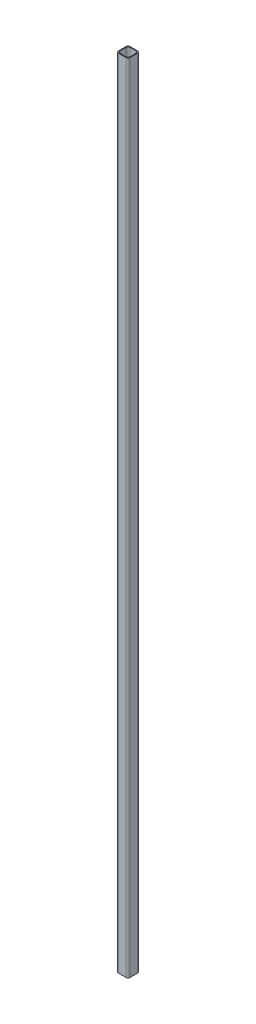
ISO-10303-21;
HEADER;
FILE_DESCRIPTION(('STEP AP214'),'2;1');
FILE_NAME('part.step','',(''),(''),'','','');
FILE_SCHEMA(('AUTOMOTIVE_DESIGN { 1 0 10303 214 1 1 1 1 }'));
ENDSEC;
DATA;
#1=APPLICATION_CONTEXT('core data for automotive mechanical design processes');
#2=APPLICATION_PROTOCOL_DEFINITION('international standard','automotive_design',2000,#1);
#3=PRODUCT_CONTEXT('',#1,'mechanical');
#4=PRODUCT('Part','Part','',(#3));
#5=PRODUCT_RELATED_PRODUCT_CATEGORY('part','',(#4));
#6=PRODUCT_DEFINITION_FORMATION('','',#4);
#7=PRODUCT_DEFINITION_CONTEXT('part definition',#1,'design');
#8=PRODUCT_DEFINITION('design','',#6,#7);
#9=PRODUCT_DEFINITION_SHAPE('','',#8);
#10=(LENGTH_UNIT() NAMED_UNIT(*) SI_UNIT(.MILLI.,.METRE.));
#11=(NAMED_UNIT(*) PLANE_ANGLE_UNIT() SI_UNIT($,.RADIAN.));
#12=(NAMED_UNIT(*) SI_UNIT($,.STERADIAN.) SOLID_ANGLE_UNIT());
#13=UNCERTAINTY_MEASURE_WITH_UNIT(LENGTH_MEASURE(1.E-05),#10,'distance_accuracy_value','');
#14=(GEOMETRIC_REPRESENTATION_CONTEXT(3) GLOBAL_UNCERTAINTY_ASSIGNED_CONTEXT((#13)) GLOBAL_UNIT_ASSIGNED_CONTEXT((#10,
#11,#12)) REPRESENTATION_CONTEXT('',''));
#15=CARTESIAN_POINT('',(0.,0.,0.));
#16=DIRECTION('',(0.,0.,1.));
#17=DIRECTION('',(1.,0.,0.));
#18=AXIS2_PLACEMENT_3D('',#15,#16,#17);
#19=CARTESIAN_POINT('',(20.,4120.,-20.));
#20=DIRECTION('',(0.,-1.,0.));
#21=DIRECTION('',(0.,0.,-1.));
#22=AXIS2_PLACEMENT_3D('',#19,#20,#21);
#23=PLANE('',#22);
#24=CARTESIAN_POINT('',(20.,4120.,-20.));
#25=DIRECTION('',(0.,1.,0.));
#26=DIRECTION('',(0.,0.,-1.));
#27=AXIS2_PLACEMENT_3D('',#24,#25,#26);
#28=CIRCLE('',#27,10.);
#29=CARTESIAN_POINT('',(30.,4120.,-19.9999999999999));
#30=VERTEX_POINT('',#29);
#31=CARTESIAN_POINT('',(19.9999999999999,4120.,-30.));
#32=VERTEX_POINT('',#31);
#33=EDGE_CURVE('E212',#30,#32,#28,.T.);
#34=ORIENTED_EDGE('',*,*,#33,.T.);
#35=DIRECTION('',(-1.,0.,0.));
#36=VECTOR('',#35,1.);
#37=CARTESIAN_POINT('',(-19.9999999999999,4120.,-30.));
#38=LINE('',#37,#36);
#39=CARTESIAN_POINT('',(-19.9999999999999,4120.,-30.));
#40=VERTEX_POINT('',#39);
#41=EDGE_CURVE('E215',#32,#40,#38,.T.);
#42=ORIENTED_EDGE('',*,*,#41,.T.);
#43=CARTESIAN_POINT('',(-20.,4120.,-20.));
#44=DIRECTION('',(0.,1.,0.));
#45=DIRECTION('',(0.,0.,1.));
#46=AXIS2_PLACEMENT_3D('',#43,#44,#45);
#47=CIRCLE('',#46,10.);
#48=CARTESIAN_POINT('',(-30.,4120.,-19.9999999999999));
#49=VERTEX_POINT('',#48);
#50=EDGE_CURVE('E218',#40,#49,#47,.T.);
#51=ORIENTED_EDGE('',*,*,#50,.T.);
#52=DIRECTION('',(0.,0.,1.));
#53=VECTOR('',#52,1.);
#54=CARTESIAN_POINT('',(-30.,4120.,-19.9999999999999));
#55=LINE('',#54,#53);
#56=CARTESIAN_POINT('',(-30.,4120.,19.9999999999999));
#57=VERTEX_POINT('',#56);
#58=EDGE_CURVE('E220',#49,#57,#55,.T.);
#59=ORIENTED_EDGE('',*,*,#58,.T.);
#60=CARTESIAN_POINT('',(-20.,4120.,20.));
#61=DIRECTION('',(0.,1.,0.));
#62=DIRECTION('',(0.,0.,1.));
#63=AXIS2_PLACEMENT_3D('',#60,#61,#62);
#64=CIRCLE('',#63,10.);
#65=CARTESIAN_POINT('',(-20.,4120.,30.));
#66=VERTEX_POINT('',#65);
#67=EDGE_CURVE('E222',#57,#66,#64,.T.);
#68=ORIENTED_EDGE('',*,*,#67,.T.);
#69=DIRECTION('',(1.,0.,0.));
#70=VECTOR('',#69,1.);
#71=CARTESIAN_POINT('',(-19.9999999999999,4120.,30.));
#72=LINE('',#71,#70);
#73=CARTESIAN_POINT('',(19.9999999999999,4120.,30.));
#74=VERTEX_POINT('',#73);
#75=EDGE_CURVE('E224',#66,#74,#72,.T.);
#76=ORIENTED_EDGE('',*,*,#75,.T.);
#77=CARTESIAN_POINT('',(20.,4120.,20.));
#78=DIRECTION('',(0.,1.,0.));
#79=DIRECTION('',(0.,0.,1.));
#80=AXIS2_PLACEMENT_3D('',#77,#78,#79);
#81=CIRCLE('',#80,10.);
#82=CARTESIAN_POINT('',(30.,4120.,19.9999999999999));
#83=VERTEX_POINT('',#82);
#84=EDGE_CURVE('E226',#74,#83,#81,.T.);
#85=ORIENTED_EDGE('',*,*,#84,.T.);
#86=DIRECTION('',(0.,0.,-1.));
#87=VECTOR('',#86,1.);
#88=CARTESIAN_POINT('',(30.,4120.,-19.9999999999999));
#89=LINE('',#88,#87);
#90=EDGE_CURVE('E228',#83,#30,#89,.T.);
#91=ORIENTED_EDGE('',*,*,#90,.T.);
#92=EDGE_LOOP('',(#34,#42,#51,#59,#68,#76,#85,#91));
#93=FACE_BOUND('',#92,.T.);
#94=CARTESIAN_POINT('',(16.,4120.,16.));
#95=DIRECTION('',(0.,1.,0.));
#96=DIRECTION('',(0.,0.,1.));
#97=AXIS2_PLACEMENT_3D('',#94,#95,#96);
#98=CIRCLE('',#97,10.);
#99=CARTESIAN_POINT('',(15.9999999999999,4120.,26.));
#100=VERTEX_POINT('',#99);
#101=CARTESIAN_POINT('',(26.,4120.,15.9999999999999));
#102=VERTEX_POINT('',#101);
#103=EDGE_CURVE('E147',#100,#102,#98,.T.);
#104=ORIENTED_EDGE('',*,*,#103,.F.);
#105=DIRECTION('',(1.,0.,0.));
#106=VECTOR('',#105,1.);
#107=CARTESIAN_POINT('',(-15.9999999999999,4120.,26.));
#108=LINE('',#107,#106);
#109=CARTESIAN_POINT('',(-15.9999999999999,4120.,26.));
#110=VERTEX_POINT('',#109);
#111=EDGE_CURVE('E180',#110,#100,#108,.T.);
#112=ORIENTED_EDGE('',*,*,#111,.F.);
#113=CARTESIAN_POINT('',(-16.,4120.,16.));
#114=DIRECTION('',(0.,1.,0.));
#115=DIRECTION('',(0.,0.,1.));
#116=AXIS2_PLACEMENT_3D('',#113,#114,#115);
#117=CIRCLE('',#116,10.);
#118=CARTESIAN_POINT('',(-26.,4120.,15.9999999999999));
#119=VERTEX_POINT('',#118);
#120=EDGE_CURVE('E178',#119,#110,#117,.T.);
#121=ORIENTED_EDGE('',*,*,#120,.F.);
#122=DIRECTION('',(0.,0.,1.));
#123=VECTOR('',#122,1.);
#124=CARTESIAN_POINT('',(-26.,4120.,-15.9999999999999));
#125=LINE('',#124,#123);
#126=CARTESIAN_POINT('',(-26.,4120.,-15.9999999999999));
#127=VERTEX_POINT('',#126);
#128=EDGE_CURVE('E176',#127,#119,#125,.T.);
#129=ORIENTED_EDGE('',*,*,#128,.F.);
#130=CARTESIAN_POINT('',(-16.,4120.,-16.));
#131=DIRECTION('',(0.,1.,0.));
#132=DIRECTION('',(0.,0.,1.));
#133=AXIS2_PLACEMENT_3D('',#130,#131,#132);
#134=CIRCLE('',#133,10.);
#135=CARTESIAN_POINT('',(-15.9999999999999,4120.,-26.));
#136=VERTEX_POINT('',#135);
#137=EDGE_CURVE('E174',#136,#127,#134,.T.);
#138=ORIENTED_EDGE('',*,*,#137,.F.);
#139=DIRECTION('',(-1.,0.,0.));
#140=VECTOR('',#139,1.);
#141=CARTESIAN_POINT('',(-15.9999999999999,4120.,-26.));
#142=LINE('',#141,#140);
#143=CARTESIAN_POINT('',(15.9999999999999,4120.,-26.));
#144=VERTEX_POINT('',#143);
#145=EDGE_CURVE('E170',#144,#136,#142,.T.);
#146=ORIENTED_EDGE('',*,*,#145,.F.);
#147=CARTESIAN_POINT('',(16.,4120.,-16.));
#148=DIRECTION('',(0.,1.,0.));
#149=DIRECTION('',(0.,0.,-1.));
#150=AXIS2_PLACEMENT_3D('',#147,#148,#149);
#151=CIRCLE('',#150,10.);
#152=CARTESIAN_POINT('',(26.,4120.,-15.9999999999999));
#153=VERTEX_POINT('',#152);
#154=EDGE_CURVE('E168',#153,#144,#151,.T.);
#155=ORIENTED_EDGE('',*,*,#154,.F.);
#156=DIRECTION('',(0.,0.,-1.));
#157=VECTOR('',#156,1.);
#158=CARTESIAN_POINT('',(26.,4120.,-15.9999999999999));
#159=LINE('',#158,#157);
#160=EDGE_CURVE('E155',#102,#153,#159,.T.);
#161=ORIENTED_EDGE('',*,*,#160,.F.);
#162=EDGE_LOOP('',(#104,#112,#121,#129,#138,#146,#155,#161));
#163=FACE_BOUND('',#162,.T.);
#164=ADVANCED_FACE('F34',(#93,#163),#23,.F.);
#165=CARTESIAN_POINT('',(20.,0.,-20.));
#166=DIRECTION('',(0.,-1.,0.));
#167=DIRECTION('',(0.,0.,-1.));
#168=AXIS2_PLACEMENT_3D('',#165,#166,#167);
#169=PLANE('',#168);
#170=CARTESIAN_POINT('',(20.,0.,-20.));
#171=DIRECTION('',(0.,1.,0.));
#172=DIRECTION('',(0.,0.,-1.));
#173=AXIS2_PLACEMENT_3D('',#170,#171,#172);
#174=CIRCLE('',#173,10.);
#175=CARTESIAN_POINT('',(30.,0.,-19.9999999999999));
#176=VERTEX_POINT('',#175);
#177=CARTESIAN_POINT('',(19.9999999999999,0.,-30.));
#178=VERTEX_POINT('',#177);
#179=EDGE_CURVE('E163',#176,#178,#174,.T.);
#180=ORIENTED_EDGE('',*,*,#179,.F.);
#181=DIRECTION('',(0.,0.,-1.));
#182=VECTOR('',#181,1.);
#183=CARTESIAN_POINT('',(30.,0.,-19.9999999999999));
#184=LINE('',#183,#182);
#185=CARTESIAN_POINT('',(30.,0.,19.9999999999999));
#186=VERTEX_POINT('',#185);
#187=EDGE_CURVE('E216',#186,#176,#184,.T.);
#188=ORIENTED_EDGE('',*,*,#187,.F.);
#189=CARTESIAN_POINT('',(20.,0.,20.));
#190=DIRECTION('',(0.,1.,0.));
#191=DIRECTION('',(0.,0.,1.));
#192=AXIS2_PLACEMENT_3D('',#189,#190,#191);
#193=CIRCLE('',#192,10.);
#194=CARTESIAN_POINT('',(19.9999999999999,0.,30.));
#195=VERTEX_POINT('',#194);
#196=EDGE_CURVE('E243',#195,#186,#193,.T.);
#197=ORIENTED_EDGE('',*,*,#196,.F.);
#198=DIRECTION('',(1.,0.,0.));
#199=VECTOR('',#198,1.);
#200=CARTESIAN_POINT('',(-19.9999999999999,0.,30.));
#201=LINE('',#200,#199);
#202=CARTESIAN_POINT('',(-20.,0.,30.));
#203=VERTEX_POINT('',#202);
#204=EDGE_CURVE('E241',#203,#195,#201,.T.);
#205=ORIENTED_EDGE('',*,*,#204,.F.);
#206=CARTESIAN_POINT('',(-20.,0.,20.));
#207=DIRECTION('',(0.,1.,0.));
#208=DIRECTION('',(0.,0.,1.));
#209=AXIS2_PLACEMENT_3D('',#206,#207,#208);
#210=CIRCLE('',#209,10.);
#211=CARTESIAN_POINT('',(-30.,0.,19.9999999999999));
#212=VERTEX_POINT('',#211);
#213=EDGE_CURVE('E239',#212,#203,#210,.T.);
#214=ORIENTED_EDGE('',*,*,#213,.F.);
#215=DIRECTION('',(0.,0.,1.));
#216=VECTOR('',#215,1.);
#217=CARTESIAN_POINT('',(-30.,0.,-19.9999999999999));
#218=LINE('',#217,#216);
#219=CARTESIAN_POINT('',(-30.,0.,-19.9999999999999));
#220=VERTEX_POINT('',#219);
#221=EDGE_CURVE('E237',#220,#212,#218,.T.);
#222=ORIENTED_EDGE('',*,*,#221,.F.);
#223=CARTESIAN_POINT('',(-20.,0.,-20.));
#224=DIRECTION('',(0.,1.,0.));
#225=DIRECTION('',(0.,0.,1.));
#226=AXIS2_PLACEMENT_3D('',#223,#224,#225);
#227=CIRCLE('',#226,10.);
#228=CARTESIAN_POINT('',(-19.9999999999999,0.,-30.));
#229=VERTEX_POINT('',#228);
#230=EDGE_CURVE('E235',#229,#220,#227,.T.);
#231=ORIENTED_EDGE('',*,*,#230,.F.);
#232=DIRECTION('',(-1.,0.,0.));
#233=VECTOR('',#232,1.);
#234=CARTESIAN_POINT('',(-19.9999999999999,0.,-30.));
#235=LINE('',#234,#233);
#236=EDGE_CURVE('E233',#178,#229,#235,.T.);
#237=ORIENTED_EDGE('',*,*,#236,.F.);
#238=EDGE_LOOP('',(#180,#188,#197,#205,#214,#222,#231,#237));
#239=FACE_BOUND('',#238,.T.);
#240=DIRECTION('',(1.,0.,0.));
#241=VECTOR('',#240,1.);
#242=CARTESIAN_POINT('',(-15.9999999999999,0.,26.));
#243=LINE('',#242,#241);
#244=CARTESIAN_POINT('',(-15.9999999999999,0.,26.));
#245=VERTEX_POINT('',#244);
#246=CARTESIAN_POINT('',(15.9999999999999,0.,26.));
#247=VERTEX_POINT('',#246);
#248=EDGE_CURVE('E156',#245,#247,#243,.T.);
#249=ORIENTED_EDGE('',*,*,#248,.T.);
#250=CARTESIAN_POINT('',(16.,0.,16.));
#251=DIRECTION('',(0.,1.,0.));
#252=DIRECTION('',(0.,0.,1.));
#253=AXIS2_PLACEMENT_3D('',#250,#251,#252);
#254=CIRCLE('',#253,10.);
#255=CARTESIAN_POINT('',(26.,0.,15.9999999999999));
#256=VERTEX_POINT('',#255);
#257=EDGE_CURVE('E57',#247,#256,#254,.T.);
#258=ORIENTED_EDGE('',*,*,#257,.T.);
#259=DIRECTION('',(0.,0.,-1.));
#260=VECTOR('',#259,1.);
#261=CARTESIAN_POINT('',(26.,0.,-15.9999999999999));
#262=LINE('',#261,#260);
#263=CARTESIAN_POINT('',(26.,0.,-15.9999999999999));
#264=VERTEX_POINT('',#263);
#265=EDGE_CURVE('E162',#256,#264,#262,.T.);
#266=ORIENTED_EDGE('',*,*,#265,.T.);
#267=CARTESIAN_POINT('',(16.,0.,-16.));
#268=DIRECTION('',(0.,1.,0.));
#269=DIRECTION('',(0.,0.,-1.));
#270=AXIS2_PLACEMENT_3D('',#267,#268,#269);
#271=CIRCLE('',#270,10.);
#272=CARTESIAN_POINT('',(15.9999999999999,0.,-26.));
#273=VERTEX_POINT('',#272);
#274=EDGE_CURVE('E184',#264,#273,#271,.T.);
#275=ORIENTED_EDGE('',*,*,#274,.T.);
#276=DIRECTION('',(-1.,0.,0.));
#277=VECTOR('',#276,1.);
#278=CARTESIAN_POINT('',(-15.9999999999999,0.,-26.));
#279=LINE('',#278,#277);
#280=CARTESIAN_POINT('',(-15.9999999999999,0.,-26.));
#281=VERTEX_POINT('',#280);
#282=EDGE_CURVE('E187',#273,#281,#279,.T.);
#283=ORIENTED_EDGE('',*,*,#282,.T.);
#284=CARTESIAN_POINT('',(-16.,0.,-16.));
#285=DIRECTION('',(0.,1.,0.));
#286=DIRECTION('',(0.,0.,1.));
#287=AXIS2_PLACEMENT_3D('',#284,#285,#286);
#288=CIRCLE('',#287,10.);
#289=CARTESIAN_POINT('',(-26.,0.,-15.9999999999999));
#290=VERTEX_POINT('',#289);
#291=EDGE_CURVE('E190',#281,#290,#288,.T.);
#292=ORIENTED_EDGE('',*,*,#291,.T.);
#293=DIRECTION('',(0.,0.,1.));
#294=VECTOR('',#293,1.);
#295=CARTESIAN_POINT('',(-26.,0.,-15.9999999999999));
#296=LINE('',#295,#294);
#297=CARTESIAN_POINT('',(-26.,0.,15.9999999999999));
#298=VERTEX_POINT('',#297);
#299=EDGE_CURVE('E193',#290,#298,#296,.T.);
#300=ORIENTED_EDGE('',*,*,#299,.T.);
#301=CARTESIAN_POINT('',(-16.,0.,16.));
#302=DIRECTION('',(0.,1.,0.));
#303=DIRECTION('',(0.,0.,1.));
#304=AXIS2_PLACEMENT_3D('',#301,#302,#303);
#305=CIRCLE('',#304,10.);
#306=EDGE_CURVE('E196',#298,#245,#305,.T.);
#307=ORIENTED_EDGE('',*,*,#306,.T.);
#308=EDGE_LOOP('',(#249,#258,#266,#275,#283,#292,#300,#307));
#309=FACE_BOUND('',#308,.T.);
#310=ADVANCED_FACE('F273',(#239,#309),#169,.T.);
#311=CARTESIAN_POINT('',(20.,4120.,-20.));
#312=DIRECTION('',(0.,-1.,0.));
#313=DIRECTION('',(0.,0.,-1.));
#314=AXIS2_PLACEMENT_3D('',#311,#312,#313);
#315=CYLINDRICAL_SURFACE('',#314,10.);
#316=ORIENTED_EDGE('',*,*,#179,.T.);
#317=DIRECTION('',(0.,-1.,0.));
#318=VECTOR('',#317,1.);
#319=CARTESIAN_POINT('',(19.9999999999999,4120.,-30.));
#320=LINE('',#319,#318);
#321=EDGE_CURVE('E11',#32,#178,#320,.T.);
#322=ORIENTED_EDGE('',*,*,#321,.F.);
#323=ORIENTED_EDGE('',*,*,#33,.F.);
#324=DIRECTION('',(0.,-1.,0.));
#325=VECTOR('',#324,1.);
#326=CARTESIAN_POINT('',(30.,4120.,-19.9999999999999));
#327=LINE('',#326,#325);
#328=EDGE_CURVE('E230',#30,#176,#327,.T.);
#329=ORIENTED_EDGE('',*,*,#328,.T.);
#330=EDGE_LOOP('',(#316,#322,#323,#329));
#331=FACE_BOUND('',#330,.T.);
#332=ADVANCED_FACE('F36',(#331),#315,.T.);
#333=CARTESIAN_POINT('',(-19.9999999999999,4120.,-30.));
#334=DIRECTION('',(0.,0.,1.));
#335=DIRECTION('',(1.,0.,0.));
#336=AXIS2_PLACEMENT_3D('',#333,#334,#335);
#337=PLANE('',#336);
#338=ORIENTED_EDGE('',*,*,#236,.T.);
#339=DIRECTION('',(0.,-1.,0.));
#340=VECTOR('',#339,1.);
#341=CARTESIAN_POINT('',(-19.9999999999999,4120.,-30.));
#342=LINE('',#341,#340);
#343=EDGE_CURVE('E42',#40,#229,#342,.T.);
#344=ORIENTED_EDGE('',*,*,#343,.F.);
#345=ORIENTED_EDGE('',*,*,#41,.F.);
#346=ORIENTED_EDGE('',*,*,#321,.T.);
#347=EDGE_LOOP('',(#338,#344,#345,#346));
#348=FACE_BOUND('',#347,.T.);
#349=ADVANCED_FACE('F290',(#348),#337,.F.);
#350=CARTESIAN_POINT('',(-20.,4120.,-20.));
#351=DIRECTION('',(0.,-1.,0.));
#352=DIRECTION('',(0.,0.,-1.));
#353=AXIS2_PLACEMENT_3D('',#350,#351,#352);
#354=CYLINDRICAL_SURFACE('',#353,10.);
#355=ORIENTED_EDGE('',*,*,#230,.T.);
#356=DIRECTION('',(0.,-1.,0.));
#357=VECTOR('',#356,1.);
#358=CARTESIAN_POINT('',(-30.,4120.,-19.9999999999999));
#359=LINE('',#358,#357);
#360=EDGE_CURVE('E260',#49,#220,#359,.T.);
#361=ORIENTED_EDGE('',*,*,#360,.F.);
#362=ORIENTED_EDGE('',*,*,#50,.F.);
#363=ORIENTED_EDGE('',*,*,#343,.T.);
#364=EDGE_LOOP('',(#355,#361,#362,#363));
#365=FACE_BOUND('',#364,.T.);
#366=ADVANCED_FACE('F267',(#365),#354,.T.);
#367=CARTESIAN_POINT('',(-30.,4120.,-19.9999999999999));
#368=DIRECTION('',(1.,0.,0.));
#369=DIRECTION('',(0.,0.,-1.));
#370=AXIS2_PLACEMENT_3D('',#367,#368,#369);
#371=PLANE('',#370);
#372=ORIENTED_EDGE('',*,*,#221,.T.);
#373=DIRECTION('',(0.,-1.,0.));
#374=VECTOR('',#373,1.);
#375=CARTESIAN_POINT('',(-30.,4120.,19.9999999999999));
#376=LINE('',#375,#374);
#377=EDGE_CURVE('E257',#57,#212,#376,.T.);
#378=ORIENTED_EDGE('',*,*,#377,.F.);
#379=ORIENTED_EDGE('',*,*,#58,.F.);
#380=ORIENTED_EDGE('',*,*,#360,.T.);
#381=EDGE_LOOP('',(#372,#378,#379,#380));
#382=FACE_BOUND('',#381,.T.);
#383=ADVANCED_FACE('F279',(#382),#371,.F.);
#384=CARTESIAN_POINT('',(-20.,4120.,20.));
#385=DIRECTION('',(0.,-1.,0.));
#386=DIRECTION('',(0.,0.,-1.));
#387=AXIS2_PLACEMENT_3D('',#384,#385,#386);
#388=CYLINDRICAL_SURFACE('',#387,10.);
#389=ORIENTED_EDGE('',*,*,#213,.T.);
#390=DIRECTION('',(0.,-1.,0.));
#391=VECTOR('',#390,1.);
#392=CARTESIAN_POINT('',(-20.,4120.,30.));
#393=LINE('',#392,#391);
#394=EDGE_CURVE('E254',#66,#203,#393,.T.);
#395=ORIENTED_EDGE('',*,*,#394,.F.);
#396=ORIENTED_EDGE('',*,*,#67,.F.);
#397=ORIENTED_EDGE('',*,*,#377,.T.);
#398=EDGE_LOOP('',(#389,#395,#396,#397));
#399=FACE_BOUND('',#398,.T.);
#400=ADVANCED_FACE('F283',(#399),#388,.T.);
#401=CARTESIAN_POINT('',(-19.9999999999999,4120.,30.));
#402=DIRECTION('',(0.,0.,-1.));
#403=DIRECTION('',(-1.,0.,0.));
#404=AXIS2_PLACEMENT_3D('',#401,#402,#403);
#405=PLANE('',#404);
#406=ORIENTED_EDGE('',*,*,#204,.T.);
#407=DIRECTION('',(0.,-1.,0.));
#408=VECTOR('',#407,1.);
#409=CARTESIAN_POINT('',(19.9999999999999,4120.,30.));
#410=LINE('',#409,#408);
#411=EDGE_CURVE('E251',#74,#195,#410,.T.);
#412=ORIENTED_EDGE('',*,*,#411,.F.);
#413=ORIENTED_EDGE('',*,*,#75,.F.);
#414=ORIENTED_EDGE('',*,*,#394,.T.);
#415=EDGE_LOOP('',(#406,#412,#413,#414));
#416=FACE_BOUND('',#415,.T.);
#417=ADVANCED_FACE('F303',(#416),#405,.F.);
#418=CARTESIAN_POINT('',(20.,4120.,20.));
#419=DIRECTION('',(0.,-1.,0.));
#420=DIRECTION('',(0.,0.,-1.));
#421=AXIS2_PLACEMENT_3D('',#418,#419,#420);
#422=CYLINDRICAL_SURFACE('',#421,10.);
#423=ORIENTED_EDGE('',*,*,#196,.T.);
#424=DIRECTION('',(0.,-1.,0.));
#425=VECTOR('',#424,1.);
#426=CARTESIAN_POINT('',(30.,4120.,19.9999999999999));
#427=LINE('',#426,#425);
#428=EDGE_CURVE('E248',#83,#186,#427,.T.);
#429=ORIENTED_EDGE('',*,*,#428,.F.);
#430=ORIENTED_EDGE('',*,*,#84,.F.);
#431=ORIENTED_EDGE('',*,*,#411,.T.);
#432=EDGE_LOOP('',(#423,#429,#430,#431));
#433=FACE_BOUND('',#432,.T.);
#434=ADVANCED_FACE('F301',(#433),#422,.T.);
#435=CARTESIAN_POINT('',(30.,4120.,-19.9999999999999));
#436=DIRECTION('',(-1.,0.,0.));
#437=DIRECTION('',(0.,0.,1.));
#438=AXIS2_PLACEMENT_3D('',#435,#436,#437);
#439=PLANE('',#438);
#440=ORIENTED_EDGE('',*,*,#187,.T.);
#441=ORIENTED_EDGE('',*,*,#328,.F.);
#442=ORIENTED_EDGE('',*,*,#90,.F.);
#443=ORIENTED_EDGE('',*,*,#428,.T.);
#444=EDGE_LOOP('',(#440,#441,#442,#443));
#445=FACE_BOUND('',#444,.T.);
#446=ADVANCED_FACE('F296',(#445),#439,.F.);
#447=CARTESIAN_POINT('',(16.,4120.,16.));
#448=DIRECTION('',(0.,-1.,0.));
#449=DIRECTION('',(0.,0.,-1.));
#450=AXIS2_PLACEMENT_3D('',#447,#448,#449);
#451=CYLINDRICAL_SURFACE('',#450,10.);
#452=ORIENTED_EDGE('',*,*,#257,.F.);
#453=DIRECTION('',(0.,-1.,0.));
#454=VECTOR('',#453,1.);
#455=CARTESIAN_POINT('',(15.9999999999999,4120.,26.));
#456=LINE('',#455,#454);
#457=EDGE_CURVE('E151',#100,#247,#456,.T.);
#458=ORIENTED_EDGE('',*,*,#457,.F.);
#459=ORIENTED_EDGE('',*,*,#103,.T.);
#460=DIRECTION('',(0.,-1.,0.));
#461=VECTOR('',#460,1.);
#462=CARTESIAN_POINT('',(26.,4120.,15.9999999999999));
#463=LINE('',#462,#461);
#464=EDGE_CURVE('E150',#102,#256,#463,.T.);
#465=ORIENTED_EDGE('',*,*,#464,.T.);
#466=EDGE_LOOP('',(#452,#458,#459,#465));
#467=FACE_BOUND('',#466,.T.);
#468=ADVANCED_FACE('F149',(#467),#451,.F.);
#469=CARTESIAN_POINT('',(26.,4120.,-15.9999999999999));
#470=DIRECTION('',(-1.,0.,0.));
#471=DIRECTION('',(0.,0.,1.));
#472=AXIS2_PLACEMENT_3D('',#469,#470,#471);
#473=PLANE('',#472);
#474=ORIENTED_EDGE('',*,*,#265,.F.);
#475=ORIENTED_EDGE('',*,*,#464,.F.);
#476=ORIENTED_EDGE('',*,*,#160,.T.);
#477=DIRECTION('',(0.,-1.,0.));
#478=VECTOR('',#477,1.);
#479=CARTESIAN_POINT('',(26.,4120.,-15.9999999999999));
#480=LINE('',#479,#478);
#481=EDGE_CURVE('E164',#153,#264,#480,.T.);
#482=ORIENTED_EDGE('',*,*,#481,.T.);
#483=EDGE_LOOP('',(#474,#475,#476,#482));
#484=FACE_BOUND('',#483,.T.);
#485=ADVANCED_FACE('F159',(#484),#473,.T.);
#486=CARTESIAN_POINT('',(16.,4120.,-16.));
#487=DIRECTION('',(0.,-1.,0.));
#488=DIRECTION('',(0.,0.,-1.));
#489=AXIS2_PLACEMENT_3D('',#486,#487,#488);
#490=CYLINDRICAL_SURFACE('',#489,10.);
#491=ORIENTED_EDGE('',*,*,#274,.F.);
#492=ORIENTED_EDGE('',*,*,#481,.F.);
#493=ORIENTED_EDGE('',*,*,#154,.T.);
#494=DIRECTION('',(0.,-1.,0.));
#495=VECTOR('',#494,1.);
#496=CARTESIAN_POINT('',(15.9999999999999,4120.,-26.));
#497=LINE('',#496,#495);
#498=EDGE_CURVE('E209',#144,#273,#497,.T.);
#499=ORIENTED_EDGE('',*,*,#498,.T.);
#500=EDGE_LOOP('',(#491,#492,#493,#499));
#501=FACE_BOUND('',#500,.T.);
#502=ADVANCED_FACE('F328',(#501),#490,.F.);
#503=CARTESIAN_POINT('',(-15.9999999999999,4120.,-26.));
#504=DIRECTION('',(0.,0.,1.));
#505=DIRECTION('',(1.,0.,0.));
#506=AXIS2_PLACEMENT_3D('',#503,#504,#505);
#507=PLANE('',#506);
#508=ORIENTED_EDGE('',*,*,#282,.F.);
#509=ORIENTED_EDGE('',*,*,#498,.F.);
#510=ORIENTED_EDGE('',*,*,#145,.T.);
#511=DIRECTION('',(0.,-1.,0.));
#512=VECTOR('',#511,1.);
#513=CARTESIAN_POINT('',(-15.9999999999999,4120.,-26.));
#514=LINE('',#513,#512);
#515=EDGE_CURVE('E207',#136,#281,#514,.T.);
#516=ORIENTED_EDGE('',*,*,#515,.T.);
#517=EDGE_LOOP('',(#508,#509,#510,#516));
#518=FACE_BOUND('',#517,.T.);
#519=ADVANCED_FACE('F332',(#518),#507,.T.);
#520=CARTESIAN_POINT('',(-16.,4120.,-16.));
#521=DIRECTION('',(0.,-1.,0.));
#522=DIRECTION('',(0.,0.,-1.));
#523=AXIS2_PLACEMENT_3D('',#520,#521,#522);
#524=CYLINDRICAL_SURFACE('',#523,10.);
#525=ORIENTED_EDGE('',*,*,#291,.F.);
#526=ORIENTED_EDGE('',*,*,#515,.F.);
#527=ORIENTED_EDGE('',*,*,#137,.T.);
#528=DIRECTION('',(0.,-1.,0.));
#529=VECTOR('',#528,1.);
#530=CARTESIAN_POINT('',(-26.,4120.,-15.9999999999999));
#531=LINE('',#530,#529);
#532=EDGE_CURVE('E205',#127,#290,#531,.T.);
#533=ORIENTED_EDGE('',*,*,#532,.T.);
#534=EDGE_LOOP('',(#525,#526,#527,#533));
#535=FACE_BOUND('',#534,.T.);
#536=ADVANCED_FACE('F338',(#535),#524,.F.);
#537=CARTESIAN_POINT('',(-26.,4120.,-15.9999999999999));
#538=DIRECTION('',(1.,0.,0.));
#539=DIRECTION('',(0.,0.,-1.));
#540=AXIS2_PLACEMENT_3D('',#537,#538,#539);
#541=PLANE('',#540);
#542=ORIENTED_EDGE('',*,*,#299,.F.);
#543=ORIENTED_EDGE('',*,*,#532,.F.);
#544=ORIENTED_EDGE('',*,*,#128,.T.);
#545=DIRECTION('',(0.,-1.,0.));
#546=VECTOR('',#545,1.);
#547=CARTESIAN_POINT('',(-26.,4120.,15.9999999999999));
#548=LINE('',#547,#546);
#549=EDGE_CURVE('E203',#119,#298,#548,.T.);
#550=ORIENTED_EDGE('',*,*,#549,.T.);
#551=EDGE_LOOP('',(#542,#543,#544,#550));
#552=FACE_BOUND('',#551,.T.);
#553=ADVANCED_FACE('F342',(#552),#541,.T.);
#554=CARTESIAN_POINT('',(-16.,4120.,16.));
#555=DIRECTION('',(0.,-1.,0.));
#556=DIRECTION('',(0.,0.,-1.));
#557=AXIS2_PLACEMENT_3D('',#554,#555,#556);
#558=CYLINDRICAL_SURFACE('',#557,10.);
#559=ORIENTED_EDGE('',*,*,#306,.F.);
#560=ORIENTED_EDGE('',*,*,#549,.F.);
#561=ORIENTED_EDGE('',*,*,#120,.T.);
#562=DIRECTION('',(0.,-1.,0.));
#563=VECTOR('',#562,1.);
#564=CARTESIAN_POINT('',(-15.9999999999999,4120.,26.));
#565=LINE('',#564,#563);
#566=EDGE_CURVE('E49',#110,#245,#565,.T.);
#567=ORIENTED_EDGE('',*,*,#566,.T.);
#568=EDGE_LOOP('',(#559,#560,#561,#567));
#569=FACE_BOUND('',#568,.T.);
#570=ADVANCED_FACE('F346',(#569),#558,.F.);
#571=CARTESIAN_POINT('',(-15.9999999999999,4120.,26.));
#572=DIRECTION('',(0.,0.,-1.));
#573=DIRECTION('',(-1.,0.,0.));
#574=AXIS2_PLACEMENT_3D('',#571,#572,#573);
#575=PLANE('',#574);
#576=ORIENTED_EDGE('',*,*,#248,.F.);
#577=ORIENTED_EDGE('',*,*,#566,.F.);
#578=ORIENTED_EDGE('',*,*,#111,.T.);
#579=ORIENTED_EDGE('',*,*,#457,.T.);
#580=EDGE_LOOP('',(#576,#577,#578,#579));
#581=FACE_BOUND('',#580,.T.);
#582=ADVANCED_FACE('F350',(#581),#575,.T.);
#583=CLOSED_SHELL('',(#164,#310,#332,#349,#366,#383,#400,#417,#434,#446,#468,#485,#502,#519,
#536,#553,#570,#582));
#584=MANIFOLD_SOLID_BREP('B2',#583);
#585=ADVANCED_BREP_SHAPE_REPRESENTATION('',(#18,#584),#14);
#586=SHAPE_DEFINITION_REPRESENTATION(#9,#585);
ENDSEC;
END-ISO-10303-21;
